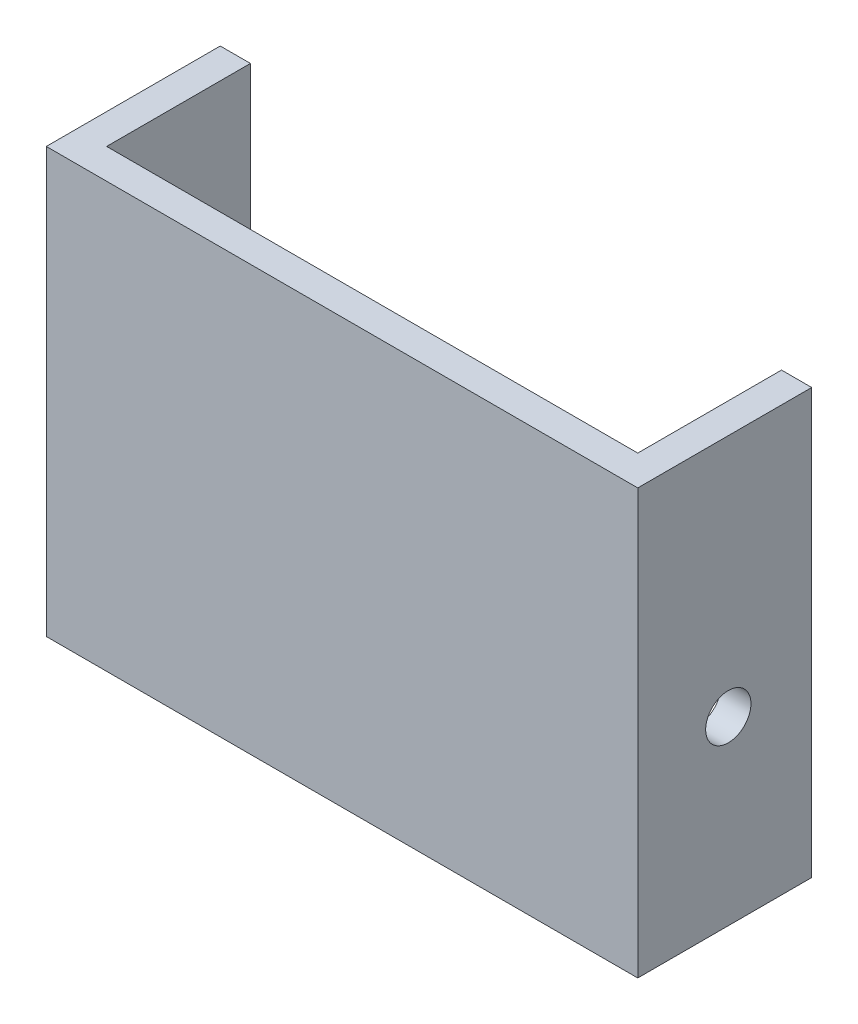
ISO-10303-21;
HEADER;
FILE_DESCRIPTION(('STEP AP214'),'2;1');
FILE_NAME('part.step','',(''),(''),'','','');
FILE_SCHEMA(('AUTOMOTIVE_DESIGN { 1 0 10303 214 1 1 1 1 }'));
ENDSEC;
DATA;
#1=APPLICATION_CONTEXT('core data for automotive mechanical design processes');
#2=APPLICATION_PROTOCOL_DEFINITION('international standard','automotive_design',2000,#1);
#3=PRODUCT_CONTEXT('',#1,'mechanical');
#4=PRODUCT('Part','Part','',(#3));
#5=PRODUCT_RELATED_PRODUCT_CATEGORY('part','',(#4));
#6=PRODUCT_DEFINITION_FORMATION('','',#4);
#7=PRODUCT_DEFINITION_CONTEXT('part definition',#1,'design');
#8=PRODUCT_DEFINITION('design','',#6,#7);
#9=PRODUCT_DEFINITION_SHAPE('','',#8);
#10=(LENGTH_UNIT() NAMED_UNIT(*) SI_UNIT(.MILLI.,.METRE.));
#11=(NAMED_UNIT(*) PLANE_ANGLE_UNIT() SI_UNIT($,.RADIAN.));
#12=(NAMED_UNIT(*) SI_UNIT($,.STERADIAN.) SOLID_ANGLE_UNIT());
#13=UNCERTAINTY_MEASURE_WITH_UNIT(LENGTH_MEASURE(1.E-05),#10,'distance_accuracy_value','');
#14=(GEOMETRIC_REPRESENTATION_CONTEXT(3) GLOBAL_UNCERTAINTY_ASSIGNED_CONTEXT((#13)) GLOBAL_UNIT_ASSIGNED_CONTEXT((#10,
#11,#12)) REPRESENTATION_CONTEXT('',''));
#15=CARTESIAN_POINT('',(0.,0.,0.));
#16=DIRECTION('',(0.,0.,1.));
#17=DIRECTION('',(1.,0.,0.));
#18=AXIS2_PLACEMENT_3D('',#15,#16,#17);
#19=CARTESIAN_POINT('',(-17.6,14.065,2.));
#20=DIRECTION('',(0.,-1.,0.));
#21=DIRECTION('',(0.,0.,-1.));
#22=AXIS2_PLACEMENT_3D('',#19,#20,#21);
#23=PLANE('',#22);
#24=DIRECTION('',(-1.,0.,0.));
#25=VECTOR('',#24,1.);
#26=CARTESIAN_POINT('',(-17.6,14.065,0.));
#27=LINE('',#26,#25);
#28=CARTESIAN_POINT('',(17.6,14.065,0.));
#29=VERTEX_POINT('',#28);
#30=CARTESIAN_POINT('',(-17.6,14.065,0.));
#31=VERTEX_POINT('',#30);
#32=EDGE_CURVE('E67',#29,#31,#27,.T.);
#33=ORIENTED_EDGE('',*,*,#32,.T.);
#34=DIRECTION('',(0.,0.,-1.));
#35=VECTOR('',#34,1.);
#36=CARTESIAN_POINT('',(-17.6,14.065,2.));
#37=LINE('',#36,#35);
#38=CARTESIAN_POINT('',(-17.6,14.065,-9.52823596313124));
#39=VERTEX_POINT('',#38);
#40=EDGE_CURVE('E146',#31,#39,#37,.T.);
#41=ORIENTED_EDGE('',*,*,#40,.T.);
#42=DIRECTION('',(1.,0.,0.));
#43=VECTOR('',#42,1.);
#44=CARTESIAN_POINT('',(-19.6,14.065,-9.52823596313124));
#45=LINE('',#44,#43);
#46=CARTESIAN_POINT('',(-19.6,14.065,-9.52823596313124));
#47=VERTEX_POINT('',#46);
#48=EDGE_CURVE('E121',#47,#39,#45,.T.);
#49=ORIENTED_EDGE('',*,*,#48,.F.);
#50=DIRECTION('',(0.,0.,-1.));
#51=VECTOR('',#50,1.);
#52=CARTESIAN_POINT('',(-19.6,14.065,2.));
#53=LINE('',#52,#51);
#54=CARTESIAN_POINT('',(-19.6,14.065,2.));
#55=VERTEX_POINT('',#54);
#56=EDGE_CURVE('E119',#55,#47,#53,.T.);
#57=ORIENTED_EDGE('',*,*,#56,.F.);
#58=DIRECTION('',(-1.,0.,0.));
#59=VECTOR('',#58,1.);
#60=CARTESIAN_POINT('',(-17.6,14.065,2.));
#61=LINE('',#60,#59);
#62=CARTESIAN_POINT('',(19.6,14.065,2.));
#63=VERTEX_POINT('',#62);
#64=EDGE_CURVE('E52',#63,#55,#61,.T.);
#65=ORIENTED_EDGE('',*,*,#64,.F.);
#66=DIRECTION('',(0.,0.,1.));
#67=VECTOR('',#66,1.);
#68=CARTESIAN_POINT('',(19.6,14.065,2.));
#69=LINE('',#68,#67);
#70=CARTESIAN_POINT('',(19.6,14.065,-9.52823596313124));
#71=VERTEX_POINT('',#70);
#72=EDGE_CURVE('E166',#71,#63,#69,.T.);
#73=ORIENTED_EDGE('',*,*,#72,.F.);
#74=DIRECTION('',(-1.,0.,0.));
#75=VECTOR('',#74,1.);
#76=CARTESIAN_POINT('',(19.6,14.065,-9.52823596313124));
#77=LINE('',#76,#75);
#78=CARTESIAN_POINT('',(17.6,14.065,-9.52823596313124));
#79=VERTEX_POINT('',#78);
#80=EDGE_CURVE('E169',#71,#79,#77,.T.);
#81=ORIENTED_EDGE('',*,*,#80,.T.);
#82=DIRECTION('',(0.,0.,1.));
#83=VECTOR('',#82,1.);
#84=CARTESIAN_POINT('',(17.6,14.065,2.));
#85=LINE('',#84,#83);
#86=EDGE_CURVE('E160',#79,#29,#85,.T.);
#87=ORIENTED_EDGE('',*,*,#86,.T.);
#88=EDGE_LOOP('',(#33,#41,#49,#57,#65,#73,#81,#87));
#89=FACE_BOUND('',#88,.T.);
#90=ADVANCED_FACE('F43',(#89),#23,.F.);
#91=CARTESIAN_POINT('',(-17.6,-14.065,2.));
#92=DIRECTION('',(0.,1.,0.));
#93=DIRECTION('',(0.,0.,1.));
#94=AXIS2_PLACEMENT_3D('',#91,#92,#93);
#95=PLANE('',#94);
#96=DIRECTION('',(1.,0.,0.));
#97=VECTOR('',#96,1.);
#98=CARTESIAN_POINT('',(-17.6,-14.065,0.));
#99=LINE('',#98,#97);
#100=CARTESIAN_POINT('',(-17.6,-14.065,0.));
#101=VERTEX_POINT('',#100);
#102=CARTESIAN_POINT('',(17.6,-14.065,0.));
#103=VERTEX_POINT('',#102);
#104=EDGE_CURVE('E46',#101,#103,#99,.T.);
#105=ORIENTED_EDGE('',*,*,#104,.T.);
#106=DIRECTION('',(0.,0.,-1.));
#107=VECTOR('',#106,1.);
#108=CARTESIAN_POINT('',(17.6,-14.065,2.));
#109=LINE('',#108,#107);
#110=CARTESIAN_POINT('',(17.6,-14.065,-9.52823596313124));
#111=VERTEX_POINT('',#110);
#112=EDGE_CURVE('E156',#103,#111,#109,.T.);
#113=ORIENTED_EDGE('',*,*,#112,.T.);
#114=DIRECTION('',(-1.,0.,0.));
#115=VECTOR('',#114,1.);
#116=CARTESIAN_POINT('',(19.6,-14.065,-9.52823596313124));
#117=LINE('',#116,#115);
#118=CARTESIAN_POINT('',(19.6,-14.065,-9.52823596313124));
#119=VERTEX_POINT('',#118);
#120=EDGE_CURVE('E180',#119,#111,#117,.T.);
#121=ORIENTED_EDGE('',*,*,#120,.F.);
#122=DIRECTION('',(0.,0.,-1.));
#123=VECTOR('',#122,1.);
#124=CARTESIAN_POINT('',(19.6,-14.065,2.));
#125=LINE('',#124,#123);
#126=CARTESIAN_POINT('',(19.6,-14.065,2.));
#127=VERTEX_POINT('',#126);
#128=EDGE_CURVE('E159',#127,#119,#125,.T.);
#129=ORIENTED_EDGE('',*,*,#128,.F.);
#130=DIRECTION('',(1.,0.,0.));
#131=VECTOR('',#130,1.);
#132=CARTESIAN_POINT('',(-17.6,-14.065,2.));
#133=LINE('',#132,#131);
#134=CARTESIAN_POINT('',(-19.6,-14.065,2.));
#135=VERTEX_POINT('',#134);
#136=EDGE_CURVE('E11',#135,#127,#133,.T.);
#137=ORIENTED_EDGE('',*,*,#136,.F.);
#138=DIRECTION('',(0.,0.,1.));
#139=VECTOR('',#138,1.);
#140=CARTESIAN_POINT('',(-19.6,-14.065,2.));
#141=LINE('',#140,#139);
#142=CARTESIAN_POINT('',(-19.6,-14.065,-9.52823596313124));
#143=VERTEX_POINT('',#142);
#144=EDGE_CURVE('E130',#143,#135,#141,.T.);
#145=ORIENTED_EDGE('',*,*,#144,.F.);
#146=DIRECTION('',(1.,0.,0.));
#147=VECTOR('',#146,1.);
#148=CARTESIAN_POINT('',(-19.6,-14.065,-9.52823596313124));
#149=LINE('',#148,#147);
#150=CARTESIAN_POINT('',(-17.6,-14.065,-9.52823596313124));
#151=VERTEX_POINT('',#150);
#152=EDGE_CURVE('E145',#143,#151,#149,.T.);
#153=ORIENTED_EDGE('',*,*,#152,.T.);
#154=DIRECTION('',(0.,0.,1.));
#155=VECTOR('',#154,1.);
#156=CARTESIAN_POINT('',(-17.6,-14.065,2.));
#157=LINE('',#156,#155);
#158=EDGE_CURVE('E132',#151,#101,#157,.T.);
#159=ORIENTED_EDGE('',*,*,#158,.T.);
#160=EDGE_LOOP('',(#105,#113,#121,#129,#137,#145,#153,#159));
#161=FACE_BOUND('',#160,.T.);
#162=ADVANCED_FACE('F199',(#161),#95,.F.);
#163=CARTESIAN_POINT('',(0.,0.,2.));
#164=DIRECTION('',(0.,0.,-1.));
#165=DIRECTION('',(-1.,0.,0.));
#166=AXIS2_PLACEMENT_3D('',#163,#164,#165);
#167=PLANE('',#166);
#168=ORIENTED_EDGE('',*,*,#136,.T.);
#169=DIRECTION('',(0.,-1.,0.));
#170=VECTOR('',#169,1.);
#171=CARTESIAN_POINT('',(19.6,14.065,2.));
#172=LINE('',#171,#170);
#173=EDGE_CURVE('E113',#63,#127,#172,.T.);
#174=ORIENTED_EDGE('',*,*,#173,.F.);
#175=ORIENTED_EDGE('',*,*,#64,.T.);
#176=DIRECTION('',(0.,1.,0.));
#177=VECTOR('',#176,1.);
#178=CARTESIAN_POINT('',(-19.6,-14.065,2.));
#179=LINE('',#178,#177);
#180=EDGE_CURVE('E111',#135,#55,#179,.T.);
#181=ORIENTED_EDGE('',*,*,#180,.F.);
#182=EDGE_LOOP('',(#168,#174,#175,#181));
#183=FACE_BOUND('',#182,.T.);
#184=ADVANCED_FACE('F109',(#183),#167,.F.);
#185=CARTESIAN_POINT('',(0.,0.,0.));
#186=DIRECTION('',(0.,0.,-1.));
#187=DIRECTION('',(-1.,0.,0.));
#188=AXIS2_PLACEMENT_3D('',#185,#186,#187);
#189=PLANE('',#188);
#190=DIRECTION('',(0.,1.,0.));
#191=VECTOR('',#190,1.);
#192=CARTESIAN_POINT('',(17.6,-14.065,0.));
#193=LINE('',#192,#191);
#194=EDGE_CURVE('E183',#103,#29,#193,.T.);
#195=ORIENTED_EDGE('',*,*,#194,.F.);
#196=ORIENTED_EDGE('',*,*,#104,.F.);
#197=DIRECTION('',(0.,-1.,0.));
#198=VECTOR('',#197,1.);
#199=CARTESIAN_POINT('',(-17.6,-14.065,0.));
#200=LINE('',#199,#198);
#201=EDGE_CURVE('E189',#31,#101,#200,.T.);
#202=ORIENTED_EDGE('',*,*,#201,.F.);
#203=ORIENTED_EDGE('',*,*,#32,.F.);
#204=EDGE_LOOP('',(#195,#196,#202,#203));
#205=FACE_BOUND('',#204,.T.);
#206=ADVANCED_FACE('F223',(#205),#189,.T.);
#207=CARTESIAN_POINT('',(17.6,0.,0.));
#208=DIRECTION('',(1.,0.,0.));
#209=DIRECTION('',(0.,0.,-1.));
#210=AXIS2_PLACEMENT_3D('',#207,#208,#209);
#211=PLANE('',#210);
#212=CARTESIAN_POINT('',(17.6,-2.065,-4.));
#213=DIRECTION('',(1.,0.,0.));
#214=DIRECTION('',(0.,0.,-1.));
#215=AXIS2_PLACEMENT_3D('',#212,#213,#214);
#216=CIRCLE('',#215,1.5);
#217=CARTESIAN_POINT('',(17.6,-2.065,-5.5));
#218=VERTEX_POINT('',#217);
#219=EDGE_CURVE('E138',#218,#218,#216,.T.);
#220=ORIENTED_EDGE('',*,*,#219,.T.);
#221=EDGE_LOOP('',(#220));
#222=FACE_BOUND('',#221,.T.);
#223=ORIENTED_EDGE('',*,*,#112,.F.);
#224=ORIENTED_EDGE('',*,*,#194,.T.);
#225=ORIENTED_EDGE('',*,*,#86,.F.);
#226=DIRECTION('',(0.,1.,0.));
#227=VECTOR('',#226,1.);
#228=CARTESIAN_POINT('',(17.6,14.065,-9.52823596313124));
#229=LINE('',#228,#227);
#230=EDGE_CURVE('E172',#111,#79,#229,.T.);
#231=ORIENTED_EDGE('',*,*,#230,.F.);
#232=EDGE_LOOP('',(#223,#224,#225,#231));
#233=FACE_BOUND('',#232,.T.);
#234=ADVANCED_FACE('F227',(#222,#233),#211,.F.);
#235=CARTESIAN_POINT('',(19.6,14.065,-9.52823596313124));
#236=DIRECTION('',(0.,0.,1.));
#237=DIRECTION('',(0.,-1.,0.));
#238=AXIS2_PLACEMENT_3D('',#235,#236,#237);
#239=PLANE('',#238);
#240=ORIENTED_EDGE('',*,*,#230,.T.);
#241=ORIENTED_EDGE('',*,*,#80,.F.);
#242=DIRECTION('',(0.,1.,0.));
#243=VECTOR('',#242,1.);
#244=CARTESIAN_POINT('',(19.6,14.065,-9.52823596313124));
#245=LINE('',#244,#243);
#246=EDGE_CURVE('E163',#119,#71,#245,.T.);
#247=ORIENTED_EDGE('',*,*,#246,.F.);
#248=ORIENTED_EDGE('',*,*,#120,.T.);
#249=EDGE_LOOP('',(#240,#241,#247,#248));
#250=FACE_BOUND('',#249,.T.);
#251=ADVANCED_FACE('F229',(#250),#239,.F.);
#252=CARTESIAN_POINT('',(19.6,0.,0.));
#253=DIRECTION('',(1.,0.,0.));
#254=DIRECTION('',(0.,0.,-1.));
#255=AXIS2_PLACEMENT_3D('',#252,#253,#254);
#256=PLANE('',#255);
#257=CARTESIAN_POINT('',(19.6,-2.065,-4.));
#258=DIRECTION('',(1.,0.,0.));
#259=DIRECTION('',(0.,0.,-1.));
#260=AXIS2_PLACEMENT_3D('',#257,#258,#259);
#261=CIRCLE('',#260,1.5);
#262=CARTESIAN_POINT('',(19.6,-2.065,-5.5));
#263=VERTEX_POINT('',#262);
#264=EDGE_CURVE('E242',#263,#263,#261,.T.);
#265=ORIENTED_EDGE('',*,*,#264,.F.);
#266=EDGE_LOOP('',(#265));
#267=FACE_BOUND('',#266,.T.);
#268=ORIENTED_EDGE('',*,*,#173,.T.);
#269=ORIENTED_EDGE('',*,*,#128,.T.);
#270=ORIENTED_EDGE('',*,*,#246,.T.);
#271=ORIENTED_EDGE('',*,*,#72,.T.);
#272=EDGE_LOOP('',(#268,#269,#270,#271));
#273=FACE_BOUND('',#272,.T.);
#274=ADVANCED_FACE('F212',(#267,#273),#256,.T.);
#275=CARTESIAN_POINT('',(-17.6,0.,0.));
#276=DIRECTION('',(-1.,0.,0.));
#277=DIRECTION('',(0.,0.,1.));
#278=AXIS2_PLACEMENT_3D('',#275,#276,#277);
#279=PLANE('',#278);
#280=CARTESIAN_POINT('',(-17.6,-2.065,-4.));
#281=DIRECTION('',(-1.,0.,0.));
#282=DIRECTION('',(0.,0.,1.));
#283=AXIS2_PLACEMENT_3D('',#280,#281,#282);
#284=CIRCLE('',#283,1.5);
#285=CARTESIAN_POINT('',(-17.6,-2.065,-2.5));
#286=VERTEX_POINT('',#285);
#287=EDGE_CURVE('E257',#286,#286,#284,.T.);
#288=ORIENTED_EDGE('',*,*,#287,.T.);
#289=EDGE_LOOP('',(#288));
#290=FACE_BOUND('',#289,.T.);
#291=ORIENTED_EDGE('',*,*,#40,.F.);
#292=ORIENTED_EDGE('',*,*,#201,.T.);
#293=ORIENTED_EDGE('',*,*,#158,.F.);
#294=DIRECTION('',(0.,-1.,0.));
#295=VECTOR('',#294,1.);
#296=CARTESIAN_POINT('',(-17.6,-14.065,-9.52823596313124));
#297=LINE('',#296,#295);
#298=EDGE_CURVE('E135',#39,#151,#297,.T.);
#299=ORIENTED_EDGE('',*,*,#298,.F.);
#300=EDGE_LOOP('',(#291,#292,#293,#299));
#301=FACE_BOUND('',#300,.T.);
#302=ADVANCED_FACE('F196',(#290,#301),#279,.F.);
#303=CARTESIAN_POINT('',(-19.6,-14.065,-9.52823596313124));
#304=DIRECTION('',(0.,0.,1.));
#305=DIRECTION('',(1.,0.,0.));
#306=AXIS2_PLACEMENT_3D('',#303,#304,#305);
#307=PLANE('',#306);
#308=ORIENTED_EDGE('',*,*,#298,.T.);
#309=ORIENTED_EDGE('',*,*,#152,.F.);
#310=DIRECTION('',(0.,-1.,0.));
#311=VECTOR('',#310,1.);
#312=CARTESIAN_POINT('',(-19.6,-14.065,-9.52823596313124));
#313=LINE('',#312,#311);
#314=EDGE_CURVE('E125',#47,#143,#313,.T.);
#315=ORIENTED_EDGE('',*,*,#314,.F.);
#316=ORIENTED_EDGE('',*,*,#48,.T.);
#317=EDGE_LOOP('',(#308,#309,#315,#316));
#318=FACE_BOUND('',#317,.T.);
#319=ADVANCED_FACE('F202',(#318),#307,.F.);
#320=CARTESIAN_POINT('',(-19.6,0.,0.));
#321=DIRECTION('',(-1.,0.,0.));
#322=DIRECTION('',(0.,0.,1.));
#323=AXIS2_PLACEMENT_3D('',#320,#321,#322);
#324=PLANE('',#323);
#325=CARTESIAN_POINT('',(-19.6,-2.065,-4.));
#326=DIRECTION('',(1.,0.,0.));
#327=DIRECTION('',(0.,0.,-1.));
#328=AXIS2_PLACEMENT_3D('',#325,#326,#327);
#329=CIRCLE('',#328,1.5);
#330=CARTESIAN_POINT('',(-19.6,-2.065,-5.5));
#331=VERTEX_POINT('',#330);
#332=EDGE_CURVE('E253',#331,#331,#329,.T.);
#333=ORIENTED_EDGE('',*,*,#332,.T.);
#334=EDGE_LOOP('',(#333));
#335=FACE_BOUND('',#334,.T.);
#336=ORIENTED_EDGE('',*,*,#180,.T.);
#337=ORIENTED_EDGE('',*,*,#56,.T.);
#338=ORIENTED_EDGE('',*,*,#314,.T.);
#339=ORIENTED_EDGE('',*,*,#144,.T.);
#340=EDGE_LOOP('',(#336,#337,#338,#339));
#341=FACE_BOUND('',#340,.T.);
#342=ADVANCED_FACE('F128',(#335,#341),#324,.T.);
#343=CARTESIAN_POINT('',(-19.6,-2.065,-4.));
#344=DIRECTION('',(1.,0.,0.));
#345=DIRECTION('',(0.,0.,-1.));
#346=AXIS2_PLACEMENT_3D('',#343,#344,#345);
#347=CYLINDRICAL_SURFACE('',#346,1.5);
#348=ORIENTED_EDGE('',*,*,#332,.F.);
#349=EDGE_LOOP('',(#348));
#350=FACE_BOUND('',#349,.T.);
#351=ORIENTED_EDGE('',*,*,#287,.F.);
#352=EDGE_LOOP('',(#351));
#353=FACE_BOUND('',#352,.T.);
#354=ADVANCED_FACE('F209',(#350,#353),#347,.F.);
#355=ORIENTED_EDGE('',*,*,#264,.T.);
#356=EDGE_LOOP('',(#355));
#357=FACE_BOUND('',#356,.T.);
#358=ORIENTED_EDGE('',*,*,#219,.F.);
#359=EDGE_LOOP('',(#358));
#360=FACE_BOUND('',#359,.T.);
#361=ADVANCED_FACE('F266',(#357,#360),#347,.F.);
#362=CLOSED_SHELL('',(#90,#162,#184,#206,#234,#251,#274,#302,#319,#342,#354,#361));
#363=MANIFOLD_SOLID_BREP('B2',#362);
#364=ADVANCED_BREP_SHAPE_REPRESENTATION('',(#18,#363),#14);
#365=SHAPE_DEFINITION_REPRESENTATION(#9,#364);
ENDSEC;
END-ISO-10303-21;
